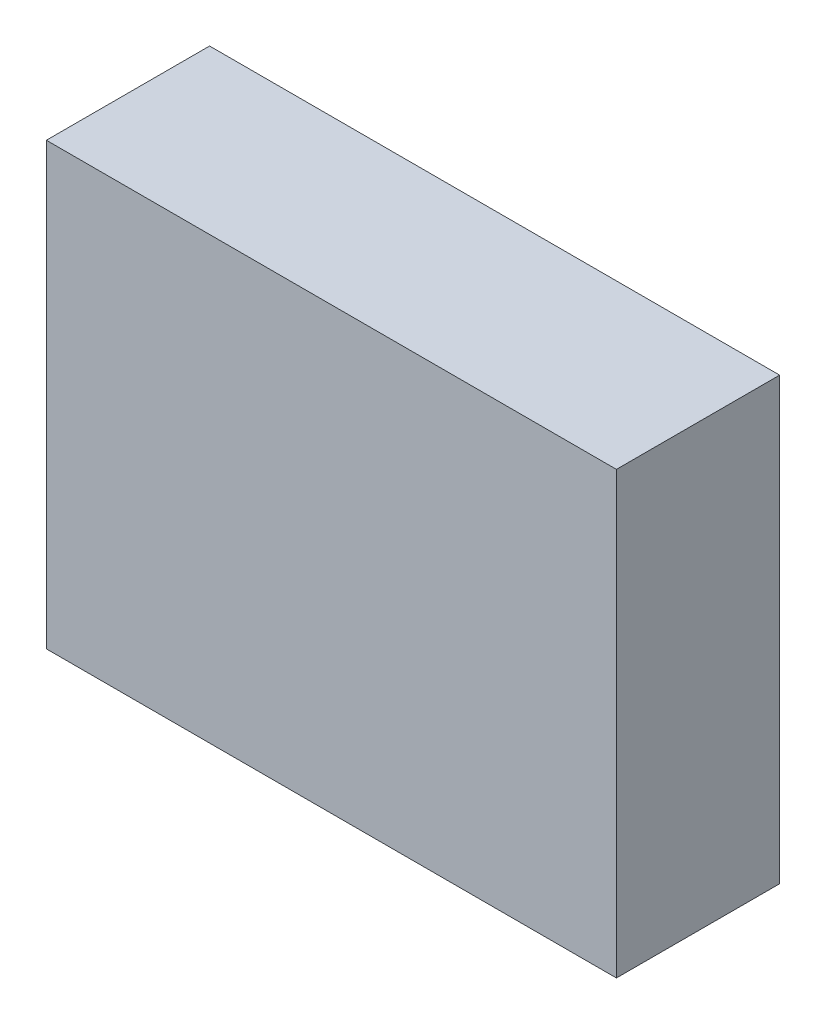
ISO-10303-21;
HEADER;
FILE_DESCRIPTION(('STEP AP214'),'2;1');
FILE_NAME('part.step','',(''),(''),'','','');
FILE_SCHEMA(('AUTOMOTIVE_DESIGN { 1 0 10303 214 1 1 1 1 }'));
ENDSEC;
DATA;
#1=APPLICATION_CONTEXT('core data for automotive mechanical design processes');
#2=APPLICATION_PROTOCOL_DEFINITION('international standard','automotive_design',2000,#1);
#3=PRODUCT_CONTEXT('',#1,'mechanical');
#4=PRODUCT('Part','Part','',(#3));
#5=PRODUCT_RELATED_PRODUCT_CATEGORY('part','',(#4));
#6=PRODUCT_DEFINITION_FORMATION('','',#4);
#7=PRODUCT_DEFINITION_CONTEXT('part definition',#1,'design');
#8=PRODUCT_DEFINITION('design','',#6,#7);
#9=PRODUCT_DEFINITION_SHAPE('','',#8);
#10=(LENGTH_UNIT() NAMED_UNIT(*) SI_UNIT(.MILLI.,.METRE.));
#11=(NAMED_UNIT(*) PLANE_ANGLE_UNIT() SI_UNIT($,.RADIAN.));
#12=(NAMED_UNIT(*) SI_UNIT($,.STERADIAN.) SOLID_ANGLE_UNIT());
#13=UNCERTAINTY_MEASURE_WITH_UNIT(LENGTH_MEASURE(1.E-05),#10,'distance_accuracy_value','');
#14=(GEOMETRIC_REPRESENTATION_CONTEXT(3) GLOBAL_UNCERTAINTY_ASSIGNED_CONTEXT((#13)) GLOBAL_UNIT_ASSIGNED_CONTEXT((#10,
#11,#12)) REPRESENTATION_CONTEXT('',''));
#15=CARTESIAN_POINT('',(0.,0.,0.));
#16=DIRECTION('',(0.,0.,1.));
#17=DIRECTION('',(1.,0.,0.));
#18=AXIS2_PLACEMENT_3D('',#15,#16,#17);
#19=CARTESIAN_POINT('',(-2.79400254,-2.159,1.59999934));
#20=DIRECTION('',(0.,0.,-1.));
#21=DIRECTION('',(-1.,0.,0.));
#22=AXIS2_PLACEMENT_3D('',#19,#20,#21);
#23=PLANE('',#22);
#24=DIRECTION('',(1.17646989809436E-06,0.999999999999308,0.));
#25=VECTOR('',#24,1.);
#26=CARTESIAN_POINT('',(2.79399745999525,-2.15900657411379,1.59999934));
#27=LINE('',#26,#25);
#28=CARTESIAN_POINT('',(2.79399746,-2.15900254,1.59999934));
#29=VERTEX_POINT('',#28);
#30=CARTESIAN_POINT('',(2.79400254000001,2.159,1.59999934));
#31=VERTEX_POINT('',#30);
#32=EDGE_CURVE('E63',#29,#31,#27,.T.);
#33=ORIENTED_EDGE('',*,*,#32,.T.);
#34=DIRECTION('',(-0.999999999999897,4.54545455279653E-07,0.));
#35=VECTOR('',#34,1.);
#36=CARTESIAN_POINT('',(-2.79400057727157,2.15900254000142,1.59999934));
#37=LINE('',#36,#35);
#38=CARTESIAN_POINT('',(-2.79399746,2.15900254,1.59999934));
#39=VERTEX_POINT('',#38);
#40=EDGE_CURVE('E60',#31,#39,#37,.T.);
#41=ORIENTED_EDGE('',*,*,#40,.T.);
#42=DIRECTION('',(-1.17646989480336E-06,-0.999999999999308,0.));
#43=VECTOR('',#42,1.);
#44=CARTESIAN_POINT('',(-2.79400253999999,-2.159,1.59999934));
#45=LINE('',#44,#43);
#46=CARTESIAN_POINT('',(-2.79400254,-2.159,1.59999934));
#47=VERTEX_POINT('',#46);
#48=EDGE_CURVE('E20',#39,#47,#45,.T.);
#49=ORIENTED_EDGE('',*,*,#48,.T.);
#50=DIRECTION('',(0.999999999999897,-4.54545454008053E-07,0.));
#51=VECTOR('',#50,1.);
#52=CARTESIAN_POINT('',(-2.79400254,-2.159,1.59999934));
#53=LINE('',#52,#51);
#54=EDGE_CURVE('E95',#47,#29,#53,.T.);
#55=ORIENTED_EDGE('',*,*,#54,.T.);
#56=EDGE_LOOP('',(#33,#41,#49,#55));
#57=FACE_BOUND('',#56,.T.);
#58=ADVANCED_FACE('F17',(#57),#23,.F.);
#59=CARTESIAN_POINT('',(-2.79399746,2.15900254,0.));
#60=DIRECTION('',(0.999999999999308,-1.17646989480336E-06,0.));
#61=DIRECTION('',(1.17646989480336E-06,0.999999999999308,0.));
#62=AXIS2_PLACEMENT_3D('',#59,#60,#61);
#63=PLANE('',#62);
#64=DIRECTION('',(0.,0.,1.));
#65=VECTOR('',#64,1.);
#66=CARTESIAN_POINT('',(-2.79400254,-2.159,0.));
#67=LINE('',#66,#65);
#68=CARTESIAN_POINT('',(-2.79400254,-2.159,0.));
#69=VERTEX_POINT('',#68);
#70=EDGE_CURVE('E72',#69,#47,#67,.T.);
#71=ORIENTED_EDGE('',*,*,#70,.T.);
#72=ORIENTED_EDGE('',*,*,#48,.F.);
#73=DIRECTION('',(0.,0.,1.));
#74=VECTOR('',#73,1.);
#75=CARTESIAN_POINT('',(-2.79399746,2.15900254,0.));
#76=LINE('',#75,#74);
#77=CARTESIAN_POINT('',(-2.79399746,2.15900254,0.));
#78=VERTEX_POINT('',#77);
#79=EDGE_CURVE('E67',#39,#78,#76,.F.);
#80=ORIENTED_EDGE('',*,*,#79,.T.);
#81=DIRECTION('',(1.17646989480336E-06,0.999999999999308,0.));
#82=VECTOR('',#81,1.);
#83=CARTESIAN_POINT('',(-2.79399746,2.15900254,0.));
#84=LINE('',#83,#82);
#85=EDGE_CURVE('E93',#69,#78,#84,.T.);
#86=ORIENTED_EDGE('',*,*,#85,.F.);
#87=EDGE_LOOP('',(#71,#72,#80,#86));
#88=FACE_BOUND('',#87,.T.);
#89=ADVANCED_FACE('F69',(#88),#63,.F.);
#90=CARTESIAN_POINT('',(2.79400254,2.159,0.));
#91=DIRECTION('',(-4.54545455279653E-07,-0.999999999999897,0.));
#92=DIRECTION('',(0.999999999999897,-4.54545455279653E-07,0.));
#93=AXIS2_PLACEMENT_3D('',#90,#91,#92);
#94=PLANE('',#93);
#95=ORIENTED_EDGE('',*,*,#79,.F.);
#96=ORIENTED_EDGE('',*,*,#40,.F.);
#97=DIRECTION('',(0.,0.,1.));
#98=VECTOR('',#97,1.);
#99=CARTESIAN_POINT('',(2.79400254000001,2.159,0.));
#100=LINE('',#99,#98);
#101=CARTESIAN_POINT('',(2.79400254000001,2.159,0.));
#102=VERTEX_POINT('',#101);
#103=EDGE_CURVE('E84',#31,#102,#100,.F.);
#104=ORIENTED_EDGE('',*,*,#103,.T.);
#105=DIRECTION('',(0.999999999999897,-4.54545455279653E-07,0.));
#106=VECTOR('',#105,1.);
#107=CARTESIAN_POINT('',(2.79400254,2.159,0.));
#108=LINE('',#107,#106);
#109=EDGE_CURVE('E77',#78,#102,#108,.T.);
#110=ORIENTED_EDGE('',*,*,#109,.F.);
#111=EDGE_LOOP('',(#95,#96,#104,#110));
#112=FACE_BOUND('',#111,.T.);
#113=ADVANCED_FACE('F75',(#112),#94,.F.);
#114=CARTESIAN_POINT('',(2.79399746,-2.15900254,0.));
#115=DIRECTION('',(-0.999999999999308,1.17646989809436E-06,0.));
#116=DIRECTION('',(-1.17646989809436E-06,-0.999999999999308,0.));
#117=AXIS2_PLACEMENT_3D('',#114,#115,#116);
#118=PLANE('',#117);
#119=ORIENTED_EDGE('',*,*,#103,.F.);
#120=ORIENTED_EDGE('',*,*,#32,.F.);
#121=DIRECTION('',(0.,0.,1.));
#122=VECTOR('',#121,1.);
#123=CARTESIAN_POINT('',(2.79399746,-2.15900254,0.));
#124=LINE('',#123,#122);
#125=CARTESIAN_POINT('',(2.79399746,-2.15900254,0.));
#126=VERTEX_POINT('',#125);
#127=EDGE_CURVE('E36',#29,#126,#124,.F.);
#128=ORIENTED_EDGE('',*,*,#127,.T.);
#129=DIRECTION('',(-1.17646989809436E-06,-0.999999999999308,0.));
#130=VECTOR('',#129,1.);
#131=CARTESIAN_POINT('',(2.79399746,-2.15900254,0.));
#132=LINE('',#131,#130);
#133=EDGE_CURVE('E27',#102,#126,#132,.T.);
#134=ORIENTED_EDGE('',*,*,#133,.F.);
#135=EDGE_LOOP('',(#119,#120,#128,#134));
#136=FACE_BOUND('',#135,.T.);
#137=ADVANCED_FACE('F99',(#136),#118,.F.);
#138=CARTESIAN_POINT('',(-2.79400254,-2.159,0.));
#139=DIRECTION('',(4.54545454008053E-07,0.999999999999897,0.));
#140=DIRECTION('',(-0.999999999999897,4.54545454008053E-07,0.));
#141=AXIS2_PLACEMENT_3D('',#138,#139,#140);
#142=PLANE('',#141);
#143=ORIENTED_EDGE('',*,*,#127,.F.);
#144=ORIENTED_EDGE('',*,*,#54,.F.);
#145=ORIENTED_EDGE('',*,*,#70,.F.);
#146=DIRECTION('',(-0.999999999999897,4.54545454008053E-07,0.));
#147=VECTOR('',#146,1.);
#148=CARTESIAN_POINT('',(-2.79400254,-2.159,0.));
#149=LINE('',#148,#147);
#150=EDGE_CURVE('E11',#126,#69,#149,.T.);
#151=ORIENTED_EDGE('',*,*,#150,.F.);
#152=EDGE_LOOP('',(#143,#144,#145,#151));
#153=FACE_BOUND('',#152,.T.);
#154=ADVANCED_FACE('F103',(#153),#142,.F.);
#155=CARTESIAN_POINT('',(-2.79400254,-2.159,0.));
#156=DIRECTION('',(0.,0.,-1.));
#157=DIRECTION('',(-1.,0.,0.));
#158=AXIS2_PLACEMENT_3D('',#155,#156,#157);
#159=PLANE('',#158);
#160=ORIENTED_EDGE('',*,*,#133,.T.);
#161=ORIENTED_EDGE('',*,*,#150,.T.);
#162=ORIENTED_EDGE('',*,*,#85,.T.);
#163=ORIENTED_EDGE('',*,*,#109,.T.);
#164=EDGE_LOOP('',(#160,#161,#162,#163));
#165=FACE_BOUND('',#164,.T.);
#166=ADVANCED_FACE('F101',(#165),#159,.T.);
#167=CLOSED_SHELL('',(#58,#89,#113,#137,#154,#166));
#168=MANIFOLD_SOLID_BREP('B1',#167);
#169=ADVANCED_BREP_SHAPE_REPRESENTATION('',(#18,#168),#14);
#170=SHAPE_DEFINITION_REPRESENTATION(#9,#169);
ENDSEC;
END-ISO-10303-21;
